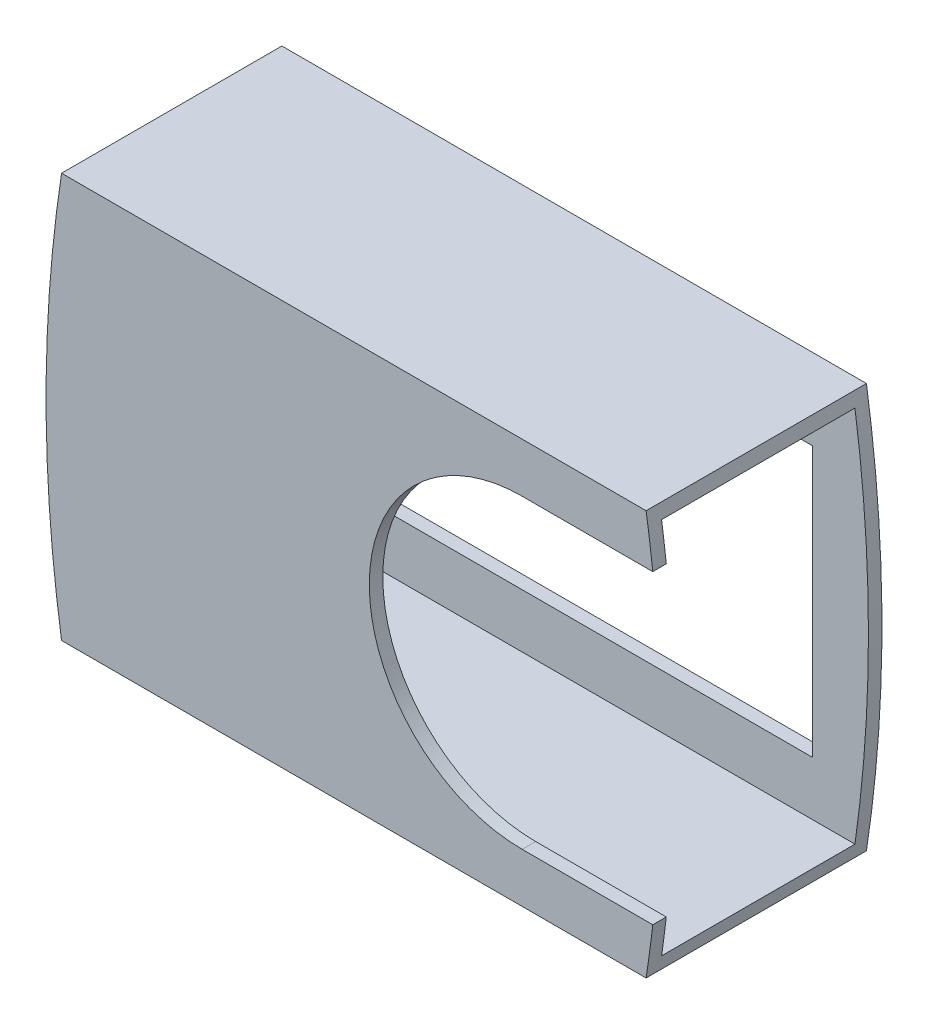
ISO-10303-21;
HEADER;
FILE_DESCRIPTION(('STEP AP214'),'2;1');
FILE_NAME('part.step','',(''),(''),'','','');
FILE_SCHEMA(('AUTOMOTIVE_DESIGN { 1 0 10303 214 1 1 1 1 }'));
ENDSEC;
DATA;
#1=APPLICATION_CONTEXT('core data for automotive mechanical design processes');
#2=APPLICATION_PROTOCOL_DEFINITION('international standard','automotive_design',2000,#1);
#3=PRODUCT_CONTEXT('',#1,'mechanical');
#4=PRODUCT('Part','Part','',(#3));
#5=PRODUCT_RELATED_PRODUCT_CATEGORY('part','',(#4));
#6=PRODUCT_DEFINITION_FORMATION('','',#4);
#7=PRODUCT_DEFINITION_CONTEXT('part definition',#1,'design');
#8=PRODUCT_DEFINITION('design','',#6,#7);
#9=PRODUCT_DEFINITION_SHAPE('','',#8);
#10=(LENGTH_UNIT() NAMED_UNIT(*) SI_UNIT(.MILLI.,.METRE.));
#11=(NAMED_UNIT(*) PLANE_ANGLE_UNIT() SI_UNIT($,.RADIAN.));
#12=(NAMED_UNIT(*) SI_UNIT($,.STERADIAN.) SOLID_ANGLE_UNIT());
#13=UNCERTAINTY_MEASURE_WITH_UNIT(LENGTH_MEASURE(1.E-05),#10,'distance_accuracy_value','');
#14=(GEOMETRIC_REPRESENTATION_CONTEXT(3) GLOBAL_UNCERTAINTY_ASSIGNED_CONTEXT((#13)) GLOBAL_UNIT_ASSIGNED_CONTEXT((#10,
#11,#12)) REPRESENTATION_CONTEXT('',''));
#15=CARTESIAN_POINT('',(0.,0.,0.));
#16=DIRECTION('',(0.,0.,1.));
#17=DIRECTION('',(1.,0.,0.));
#18=AXIS2_PLACEMENT_3D('',#15,#16,#17);
#19=CARTESIAN_POINT('',(82.7796978394473,21.,21.5));
#20=DIRECTION('',(0.,0.,-1.));
#21=DIRECTION('',(-1.,0.,0.));
#22=AXIS2_PLACEMENT_3D('',#19,#20,#21);
#23=CYLINDRICAL_SURFACE('',#22,148.);
#24=DIRECTION('',(0.,0.,-1.));
#25=VECTOR('',#24,1.);
#26=CARTESIAN_POINT('',(-63.5,43.5,21.5));
#27=LINE('',#26,#25);
#28=CARTESIAN_POINT('',(-63.5,43.5,23.));
#29=VERTEX_POINT('',#28);
#30=CARTESIAN_POINT('',(-63.5,43.5,-1.5));
#31=VERTEX_POINT('',#30);
#32=EDGE_CURVE('E273',#29,#31,#27,.T.);
#33=ORIENTED_EDGE('',*,*,#32,.T.);
#34=CARTESIAN_POINT('',(82.7796978395109,21.,-1.5));
#35=DIRECTION('',(0.,0.,-1.));
#36=DIRECTION('',(1.,0.,0.));
#37=AXIS2_PLACEMENT_3D('',#34,#35,#36);
#38=CIRCLE('',#37,148.000000000063);
#39=CARTESIAN_POINT('',(-63.5,-1.49999999999997,-1.5));
#40=VERTEX_POINT('',#39);
#41=EDGE_CURVE('E239',#40,#31,#38,.T.);
#42=ORIENTED_EDGE('',*,*,#41,.F.);
#43=DIRECTION('',(0.,0.,-1.));
#44=VECTOR('',#43,1.);
#45=CARTESIAN_POINT('',(-63.5,-1.50000000000001,21.5));
#46=LINE('',#45,#44);
#47=CARTESIAN_POINT('',(-63.5,-1.50000000000001,23.));
#48=VERTEX_POINT('',#47);
#49=EDGE_CURVE('E11',#48,#40,#46,.T.);
#50=ORIENTED_EDGE('',*,*,#49,.F.);
#51=CARTESIAN_POINT('',(82.7796978394875,21.,23.));
#52=DIRECTION('',(0.,0.,1.));
#53=DIRECTION('',(1.,0.,0.));
#54=AXIS2_PLACEMENT_3D('',#51,#52,#53);
#55=CIRCLE('',#54,148.00000000004);
#56=EDGE_CURVE('E245',#29,#48,#55,.T.);
#57=ORIENTED_EDGE('',*,*,#56,.F.);
#58=EDGE_LOOP('',(#33,#42,#50,#57));
#59=FACE_BOUND('',#58,.T.);
#60=CARTESIAN_POINT('',(-65.003927775842,29.,10.75));
#61=CARTESIAN_POINT('',(-65.0039275086395,29.000001778152,10.5254139730779));
#62=CARTESIAN_POINT('',(-65.0044408002922,28.9905389115537,10.300856504589));
#63=CARTESIAN_POINT('',(-65.006478993088,28.95275471401,9.85326520765597));
#64=CARTESIAN_POINT('',(-65.008004153516,28.9244285494595,9.63023178454153));
#65=CARTESIAN_POINT('',(-65.0120253604337,28.8490746333049,9.18712075282603));
#66=CARTESIAN_POINT('',(-65.0145224162982,28.8020274375857,8.96704646411007));
#67=CARTESIAN_POINT('',(-65.0204161443319,28.6895691716779,8.53164943649704));
#68=CARTESIAN_POINT('',(-65.0238128278599,28.6241578696174,8.31632675763257));
#69=CARTESIAN_POINT('',(-65.0314070886999,28.475479422675,7.89208050910518));
#70=CARTESIAN_POINT('',(-65.0356042398523,28.3922217760662,7.6831536027865));
#71=CARTESIAN_POINT('',(-65.0446814063763,28.20842293507,7.27305743215828));
#72=CARTESIAN_POINT('',(-65.0495614321977,28.1078814761885,7.07188828662337));
#73=CARTESIAN_POINT('',(-65.0598636262581,27.8902771106051,6.67881779795567));
#74=CARTESIAN_POINT('',(-65.0652855680156,27.7732210974412,6.48691263246792));
#75=CARTESIAN_POINT('',(-65.0765216038879,27.5233435939285,6.11357235747182));
#76=CARTESIAN_POINT('',(-65.0823358332509,27.3905166541576,5.9321408993775));
#77=CARTESIAN_POINT('',(-65.0941950195167,27.1099536754241,5.58095559780392));
#78=CARTESIAN_POINT('',(-65.1002401655878,26.9622052424585,5.41121166223511));
#79=CARTESIAN_POINT('',(-65.1123852633307,26.6529370212348,5.08476770009892));
#80=CARTESIAN_POINT('',(-65.1184852158846,26.49141701098,4.92806788388218));
#81=CARTESIAN_POINT('',(-65.130567054576,26.1557479631179,4.62882205155067));
#82=CARTESIAN_POINT('',(-65.1365489380822,25.9815986444694,4.48627635057623));
#83=CARTESIAN_POINT('',(-65.1482250896887,25.6219033508485,4.21635089459825));
#84=CARTESIAN_POINT('',(-65.1539193513898,25.4363571225172,4.08897147693389));
#85=CARTESIAN_POINT('',(-65.1648609730357,25.0551071180551,3.85023816779461));
#86=CARTESIAN_POINT('',(-65.1701081476785,24.8593991838167,3.73889090802541));
#87=CARTESIAN_POINT('',(-65.1800057925897,24.4592152306856,3.53304235549022));
#88=CARTESIAN_POINT('',(-65.1846560554216,24.2547361964521,3.43854691458622));
#89=CARTESIAN_POINT('',(-65.1932248446266,23.8385659527527,3.26714103921547));
#90=CARTESIAN_POINT('',(-65.197143508082,23.62687610321,3.19022730979499));
#91=CARTESIAN_POINT('',(-65.2041389017272,23.1977508539469,3.05451213116238));
#92=CARTESIAN_POINT('',(-65.2072156199664,22.9803153727201,2.99571093904099));
#93=CARTESIAN_POINT('',(-65.2124369705084,22.5414719026809,2.89669429309387));
#94=CARTESIAN_POINT('',(-65.2145825369033,22.3200681280124,2.85646021095178));
#95=CARTESIAN_POINT('',(-65.2178852318205,21.8746466157266,2.79477872726067));
#96=CARTESIAN_POINT('',(-65.2190423390992,21.6506288220345,2.77333172947807));
#97=CARTESIAN_POINT('',(-65.2203350647745,21.2016231940836,2.74938231505168));
#98=CARTESIAN_POINT('',(-65.2204708796531,20.9766355547434,2.7468762544428));
#99=CARTESIAN_POINT('',(-65.2197175511409,20.5271720454049,2.76081956172219));
#100=CARTESIAN_POINT('',(-65.2188280530098,20.3026963794711,2.77727549012589));
#101=CARTESIAN_POINT('',(-65.2160504912139,19.856209598079,2.82900333211636));
#102=CARTESIAN_POINT('',(-65.2141636551347,19.6341957946473,2.86425211474826));
#103=CARTESIAN_POINT('',(-65.209445569767,19.1939265091189,2.95329935576034));
#104=CARTESIAN_POINT('',(-65.2066143054561,18.9756710868622,3.00709810920209));
#105=CARTESIAN_POINT('',(-65.2000875796259,18.5444748112065,3.13285933794598));
#106=CARTESIAN_POINT('',(-65.1963921317999,18.3315338736568,3.20482152544372));
#107=CARTESIAN_POINT('',(-65.1882414929477,17.9124675574178,3.36639820038257));
#108=CARTESIAN_POINT('',(-65.1837862845219,17.7063423349483,3.4560130921061));
#109=CARTESIAN_POINT('',(-65.1742405674191,17.3023028095391,3.65228939543196));
#110=CARTESIAN_POINT('',(-65.1691498425773,17.104391331092,3.75895661069846));
#111=CARTESIAN_POINT('',(-65.1584764643809,16.7181872933254,3.98859707410967));
#112=CARTESIAN_POINT('',(-65.1528936413549,16.5298980873148,4.11157595381751));
#113=CARTESIAN_POINT('',(-65.1413965843025,16.1643758911386,4.37291548088169));
#114=CARTESIAN_POINT('',(-65.1354824080054,15.9871409863658,4.51127345296241));
#115=CARTESIAN_POINT('',(-65.1234889757667,15.6449417501266,4.80241079464234));
#116=CARTESIAN_POINT('',(-65.1174097171132,15.4799776204161,4.95519040126817));
#117=CARTESIAN_POINT('',(-65.1052505484192,15.1632895154791,5.27428970240955));
#118=CARTESIAN_POINT('',(-65.0991706472337,15.0115825074914,5.4406262367951));
#119=CARTESIAN_POINT('',(-65.0871902751648,14.7227152162388,5.78549680900998));
#120=CARTESIAN_POINT('',(-65.081289808414,14.5855552678364,5.96403112746789));
#121=CARTESIAN_POINT('',(-65.0698370472099,14.3267840336145,6.33199486988701));
#122=CARTESIAN_POINT('',(-65.0642846891141,14.2051699014079,6.52142229012223));
#123=CARTESIAN_POINT('',(-65.0536828657963,13.9782867134129,6.90992671411362));
#124=CARTESIAN_POINT('',(-65.0486335752432,13.8730233276882,7.10900703401081));
#125=CARTESIAN_POINT('',(-65.0391844109134,13.6796567793309,7.51531496953911));
#126=CARTESIAN_POINT('',(-65.0347844468293,13.5915512298662,7.72254144712842));
#127=CARTESIAN_POINT('',(-65.0267583369048,13.4331109613769,8.14369804024566));
#128=CARTESIAN_POINT('',(-65.0231322014129,13.3627764800047,8.35762824537953));
#129=CARTESIAN_POINT('',(-65.016757266019,13.2403854913655,8.79066189294827));
#130=CARTESIAN_POINT('',(-65.0140084442009,13.1883285275078,9.0097652060078));
#131=CARTESIAN_POINT('',(-65.0094663845299,13.1028630366404,9.45159405745717));
#132=CARTESIAN_POINT('',(-65.0076731670162,13.0694549065547,9.67431967284071));
#133=CARTESIAN_POINT('',(-65.0050955155874,13.0215647786484,10.1214662985437));
#134=CARTESIAN_POINT('',(-65.0043095828284,13.0070546599849,10.3458842888688));
#135=CARTESIAN_POINT('',(-65.0037638383266,12.9969705402532,10.7952421757538));
#136=CARTESIAN_POINT('',(-65.0040044627893,13.0014045889574,11.0201822535762));
#137=CARTESIAN_POINT('',(-65.0055059638065,13.0291951740262,11.4688860302054));
#138=CARTESIAN_POINT('',(-65.0067668362131,13.0525516334597,11.6926497337912));
#139=CARTESIAN_POINT('',(-65.0102721531523,13.1180052681597,12.137314043657));
#140=CARTESIAN_POINT('',(-65.0125161793936,13.1600944735369,12.3582158264596));
#141=CARTESIAN_POINT('',(-65.0179228490005,13.2626908293254,12.7956016684644));
#142=CARTESIAN_POINT('',(-65.021085150171,13.3231911192487,13.0120873412255));
#143=CARTESIAN_POINT('',(-65.028238760903,13.4621809726772,13.4391849820139));
#144=CARTESIAN_POINT('',(-65.0322300515188,13.5406701250702,13.6497970841506));
#145=CARTESIAN_POINT('',(-65.0409284949611,13.7150807438047,14.0636655221061));
#146=CARTESIAN_POINT('',(-65.0456356645768,13.811002618999,14.2669216852708));
#147=CARTESIAN_POINT('',(-65.0556322453364,14.0195935037711,14.664632241328));
#148=CARTESIAN_POINT('',(-65.0609216488822,14.1322622948109,14.8590867490342));
#149=CARTESIAN_POINT('',(-65.0719394388011,14.3736913034456,15.2380471790907));
#150=CARTESIAN_POINT('',(-65.0776683377779,14.5024704251019,15.4225410433003));
#151=CARTESIAN_POINT('',(-65.0893950623745,14.775053378055,15.7799637583814));
#152=CARTESIAN_POINT('',(-65.0953927946413,14.9188520165021,15.9528965726802));
#153=CARTESIAN_POINT('',(-65.1074902631326,15.2205208225157,16.2860756011348));
#154=CARTESIAN_POINT('',(-65.1135900185552,15.3783936632324,16.4463193942717));
#155=CARTESIAN_POINT('',(-65.1257175045837,15.707066309976,16.7529462238593));
#156=CARTESIAN_POINT('',(-65.1317452367427,15.8778658366666,16.8993295596707));
#157=CARTESIAN_POINT('',(-65.1435643740995,16.2313735174741,17.1773494098524));
#158=CARTESIAN_POINT('',(-65.149355522717,16.4140940704189,17.3089701703728));
#159=CARTESIAN_POINT('',(-65.1605303048558,16.7899829620442,17.5563483499307));
#160=CARTESIAN_POINT('',(-65.1659139448871,16.9831511337411,17.6721060224025));
#161=CARTESIAN_POINT('',(-65.1761219304677,17.3786027185168,17.8869549628864));
#162=CARTESIAN_POINT('',(-65.1809461761919,17.5808877496032,17.986043257628));
#163=CARTESIAN_POINT('',(-65.1898956871719,17.993031937137,18.1667889537121));
#164=CARTESIAN_POINT('',(-65.1940211949399,18.2028884349418,18.2484524052909));
#165=CARTESIAN_POINT('',(-65.2014567810418,18.6286727354312,18.393781249989));
#166=CARTESIAN_POINT('',(-65.2047671543526,18.8445983102596,18.4574531550349));
#167=CARTESIAN_POINT('',(-65.2104803691541,19.2810525558209,18.56638073961));
#168=CARTESIAN_POINT('',(-65.2128832309075,19.5015811236637,18.6116368303224));
#169=CARTESIAN_POINT('',(-65.2167133102086,19.9456782724215,18.6834103493834));
#170=CARTESIAN_POINT('',(-65.2181405148597,20.1692468934819,18.7099275300292));
#171=CARTESIAN_POINT('',(-65.2199786654922,20.617823945215,18.7440313156516));
#172=CARTESIAN_POINT('',(-65.220389628137,20.8428323522189,18.7516182310265));
#173=CARTESIAN_POINT('',(-65.2201837827638,21.2924410752561,18.7478099200176));
#174=CARTESIAN_POINT('',(-65.2195681009735,21.5170415682499,18.7364354942088));
#175=CARTESIAN_POINT('',(-65.2173289562002,21.9644058688189,18.694832926644));
#176=CARTESIAN_POINT('',(-65.2157058427294,22.1871702862433,18.6646113235959));
#177=CARTESIAN_POINT('',(-65.2114977305525,22.6293991062535,18.5855295284407));
#178=CARTESIAN_POINT('',(-65.2089125536961,22.8488628898077,18.5366658842459));
#179=CARTESIAN_POINT('',(-65.2028536430302,23.2828846817435,18.4206515416531));
#180=CARTESIAN_POINT('',(-65.1993799284387,23.4974427961192,18.3535012387704));
#181=CARTESIAN_POINT('',(-65.191642184809,23.9201404895079,18.2013913660712));
#182=CARTESIAN_POINT('',(-65.1873781396346,24.1282799373705,18.1164314326328));
#183=CARTESIAN_POINT('',(-65.1781805194952,24.5366581748857,17.9293102108794));
#184=CARTESIAN_POINT('',(-65.1732469542179,24.7368970788028,17.8271491714544));
#185=CARTESIAN_POINT('',(-65.1628490191566,25.1280898868974,17.6063349596051));
#186=CARTESIAN_POINT('',(-65.1573845704215,25.3190424036788,17.4876793330274));
#187=CARTESIAN_POINT('',(-65.1460819970504,25.69021635542,17.2347734128692));
#188=CARTESIAN_POINT('',(-65.1402440017048,25.8704414620664,17.1005285020228));
#189=CARTESIAN_POINT('',(-65.1283495952553,26.2191948584213,16.8171701177611));
#190=CARTESIAN_POINT('',(-65.1222928999157,26.3877070281168,16.6680368154357));
#191=CARTESIAN_POINT('',(-65.1101403329518,26.7115699319121,16.3561139543431));
#192=CARTESIAN_POINT('',(-65.1040444622076,26.8669209606071,16.193324701409));
#193=CARTESIAN_POINT('',(-65.0919845997344,27.1634047370927,15.8551947971149));
#194=CARTESIAN_POINT('',(-65.0860206434239,27.3045337016247,15.6798508271396));
#195=CARTESIAN_POINT('',(-65.0743956133338,27.5715227113629,15.3178947606072));
#196=CARTESIAN_POINT('',(-65.068734534887,27.6973829918851,15.1312828377746));
#197=CARTESIAN_POINT('',(-65.0578692011723,27.9330883872982,14.7478728510024));
#198=CARTESIAN_POINT('',(-65.0526655198185,28.0429134932402,14.5510624690179));
#199=CARTESIAN_POINT('',(-65.0428729227491,28.2455409240974,14.1489424177265));
#200=CARTESIAN_POINT('',(-65.0382837826934,28.3383494655463,13.9436358859858));
#201=CARTESIAN_POINT('',(-65.029852519319,28.5062567895374,13.5260931848419));
#202=CARTESIAN_POINT('',(-65.02600974865,28.5813709311493,13.3138632086837));
#203=CARTESIAN_POINT('',(-65.0191765090994,28.7134366214301,12.8838875218259));
#204=CARTESIAN_POINT('',(-65.016185820534,28.7703928520219,12.6661432486149));
#205=CARTESIAN_POINT('',(-65.0104686030225,28.8784784402558,12.1679841148645));
#206=CARTESIAN_POINT('',(-65.0080249231111,28.9240088990575,11.8863335258383));
#207=CARTESIAN_POINT('',(-65.0047546797992,28.9847685358796,11.3197733071697));
#208=CARTESIAN_POINT('',(-65.0039281147602,28.9999977446018,11.0348636808298));
#209=CARTESIAN_POINT('',(-65.003927775842,29.,10.75));
#210=B_SPLINE_CURVE_WITH_KNOTS('',3,(#60,#61,#62,#63,#64,#65,#66,#67,#68,#69,#70,#71,#72,#73,
#74,#75,#76,#77,#78,#79,#80,#81,#82,#83,#84,#85,#86,#87,#88,#89,#90,#91,#92,#93,#94,#95,#96,#97,
#98,#99,#100,#101,#102,#103,#104,#105,#106,#107,#108,#109,#110,#111,#112,#113,#114,#115,#116,
#117,#118,#119,#120,#121,#122,#123,#124,#125,#126,#127,#128,#129,#130,#131,#132,#133,#134,#135,
#136,#137,#138,#139,#140,#141,#142,#143,#144,#145,#146,#147,#148,#149,#150,#151,#152,#153,#154,
#155,#156,#157,#158,#159,#160,#161,#162,#163,#164,#165,#166,#167,#168,#169,#170,#171,#172,#173,
#174,#175,#176,#177,#178,#179,#180,#181,#182,#183,#184,#185,#186,#187,#188,#189,#190,#191,#192,
#193,#194,#195,#196,#197,#198,#199,#200,#201,#202,#203,#204,#205,#206,#207,#208,#209),
.UNSPECIFIED.,.T.,.F.,(4,2,2,2,2,2,2,2,2,2,2,2,2,2,2,2,2,2,2,2,2,2,2,2,2,2,2,2,2,2,2,2,2,2,2,2,
2,2,2,2,2,2,2,2,2,2,2,2,2,2,2,2,2,2,2,2,2,2,2,2,2,2,2,2,2,2,2,2,2,2,2,2,2,2,4),(0.,
0.673509171918443,1.34719099289856,2.0215743500824,2.69596622265992,3.37000005420812,
4.04404420140929,4.71780781568741,5.39180492077098,6.06636653505434,6.74093902527198,
7.41552653142945,8.0901290394363,8.7650098001417,9.44012446149892,10.1151124970364,
10.7901101129644,11.46442902587,12.1387624306815,12.812966100099,13.4874031022105,
14.1610118917562,14.8346313964262,15.5082402280881,16.1818644885406,16.8557185033056,
17.529805773082,18.2037759647331,18.8777572353429,19.552588845013,20.2274359854423,
20.9021593860856,21.577116245463,22.2519791442019,22.9268510674022,23.6017061304311,
24.2765755566114,24.9504396038881,25.624590018542,26.2987376923764,26.9725988223207,
27.6462091594853,28.3198041036969,28.9934148478886,29.6670168026002,30.341416717377,
31.0155842320516,31.6898800670488,32.36416133516,33.0391554490336,33.7141387777047,
34.3892423739138,35.0641111785125,35.738735404814,36.4133445674658,37.0879626473628,
37.7625696655181,38.4364371272386,39.1100709320445,39.7838295393058,40.4575735752525,
41.1313313684766,41.8050794136599,42.4789278102102,43.1525442254893,43.8270700699227,
44.5015808119816,45.1762705118552,45.8509498123087,46.5264639225296,47.2017307583993,
47.8764092722288,48.5509136827474,49.4051898761914,50.2594652040676),.UNSPECIFIED.);
#211=CARTESIAN_POINT('',(-65.003927775842,29.,10.75));
#212=VERTEX_POINT('',#211);
#213=EDGE_CURVE('E169',#212,#212,#210,.T.);
#214=ORIENTED_EDGE('',*,*,#213,.F.);
#215=EDGE_LOOP('',(#214));
#216=FACE_BOUND('',#215,.T.);
#217=ADVANCED_FACE('F33',(#59,#216),#23,.T.);
#218=CARTESIAN_POINT('',(84.5025597046004,21.,21.5));
#219=DIRECTION('',(0.,0.,-1.));
#220=DIRECTION('',(-1.,0.,0.));
#221=AXIS2_PLACEMENT_3D('',#218,#219,#220);
#222=CYLINDRICAL_SURFACE('',#221,148.);
#223=CARTESIAN_POINT('',(84.5025597046004,21.,0.));
#224=DIRECTION('',(0.,0.,1.));
#225=DIRECTION('',(1.,0.,0.));
#226=AXIS2_PLACEMENT_3D('',#223,#224,#225);
#227=CIRCLE('',#226,148.);
#228=CARTESIAN_POINT('',(-62.,42.,0.));
#229=VERTEX_POINT('',#228);
#230=CARTESIAN_POINT('',(-62.,0.,0.));
#231=VERTEX_POINT('',#230);
#232=EDGE_CURVE('E266',#229,#231,#227,.T.);
#233=ORIENTED_EDGE('',*,*,#232,.F.);
#234=DIRECTION('',(0.,0.,-1.));
#235=VECTOR('',#234,1.);
#236=CARTESIAN_POINT('',(-62.,42.,21.5));
#237=LINE('',#236,#235);
#238=CARTESIAN_POINT('',(-62.,42.,21.5));
#239=VERTEX_POINT('',#238);
#240=EDGE_CURVE('E271',#239,#229,#237,.T.);
#241=ORIENTED_EDGE('',*,*,#240,.F.);
#242=CARTESIAN_POINT('',(84.5025597046004,21.,21.5));
#243=DIRECTION('',(0.,0.,1.));
#244=DIRECTION('',(1.,0.,0.));
#245=AXIS2_PLACEMENT_3D('',#242,#243,#244);
#246=CIRCLE('',#245,148.);
#247=CARTESIAN_POINT('',(-62.,0.,21.5));
#248=VERTEX_POINT('',#247);
#249=EDGE_CURVE('E157',#239,#248,#246,.T.);
#250=ORIENTED_EDGE('',*,*,#249,.T.);
#251=DIRECTION('',(0.,0.,-1.));
#252=VECTOR('',#251,1.);
#253=CARTESIAN_POINT('',(-62.,0.,21.5));
#254=LINE('',#253,#252);
#255=EDGE_CURVE('E155',#248,#231,#254,.T.);
#256=ORIENTED_EDGE('',*,*,#255,.T.);
#257=EDGE_LOOP('',(#233,#241,#250,#256));
#258=FACE_BOUND('',#257,.T.);
#259=CARTESIAN_POINT('',(-63.281065910689,29.,10.75));
#260=CARTESIAN_POINT('',(-63.2810656434864,29.000001778152,10.5254139730779));
#261=CARTESIAN_POINT('',(-63.281578935139,28.9905389115537,10.300856504589));
#262=CARTESIAN_POINT('',(-63.2836171279348,28.95275471401,9.85326520765597));
#263=CARTESIAN_POINT('',(-63.2851422883629,28.9244285494595,9.63023178454153));
#264=CARTESIAN_POINT('',(-63.2891634952806,28.8490746333049,9.18712075282603));
#265=CARTESIAN_POINT('',(-63.2916605511451,28.8020274375857,8.96704646411007));
#266=CARTESIAN_POINT('',(-63.2975542791788,28.6895691716779,8.53164943649704));
#267=CARTESIAN_POINT('',(-63.3009509627068,28.6241578696174,8.31632675763256));
#268=CARTESIAN_POINT('',(-63.3085452235468,28.475479422675,7.89208050910517));
#269=CARTESIAN_POINT('',(-63.3127423746992,28.3922217760662,7.6831536027865));
#270=CARTESIAN_POINT('',(-63.3218195412232,28.20842293507,7.27305743215828));
#271=CARTESIAN_POINT('',(-63.3266995670445,28.1078814761885,7.07188828662337));
#272=CARTESIAN_POINT('',(-63.337001761105,27.8902771106051,6.67881779795567));
#273=CARTESIAN_POINT('',(-63.3424237028625,27.7732210974412,6.48691263246791));
#274=CARTESIAN_POINT('',(-63.3536597387348,27.5233435939285,6.11357235747182));
#275=CARTESIAN_POINT('',(-63.3594739680978,27.3905166541576,5.9321408993775));
#276=CARTESIAN_POINT('',(-63.3713331543636,27.1099536754241,5.58095559780391));
#277=CARTESIAN_POINT('',(-63.3773783004347,26.9622052424585,5.4112116622351));
#278=CARTESIAN_POINT('',(-63.3895233981776,26.6529370212348,5.08476770009892));
#279=CARTESIAN_POINT('',(-63.3956233507316,26.49141701098,4.92806788388218));
#280=CARTESIAN_POINT('',(-63.4077051894229,26.1557479631179,4.62882205155067));
#281=CARTESIAN_POINT('',(-63.4136870729291,25.9815986444694,4.48627635057623));
#282=CARTESIAN_POINT('',(-63.4253632245355,25.6219033508485,4.21635089459825));
#283=CARTESIAN_POINT('',(-63.4310574862367,25.4363571225172,4.08897147693389));
#284=CARTESIAN_POINT('',(-63.4419991078826,25.0551071180551,3.85023816779461));
#285=CARTESIAN_POINT('',(-63.4472462825254,24.8593991838167,3.73889090802542));
#286=CARTESIAN_POINT('',(-63.4571439274366,24.4592152306856,3.53304235549022));
#287=CARTESIAN_POINT('',(-63.4617941902685,24.2547361964521,3.43854691458622));
#288=CARTESIAN_POINT('',(-63.4703629794735,23.8385659527527,3.26714103921547));
#289=CARTESIAN_POINT('',(-63.4742816429289,23.62687610321,3.19022730979499));
#290=CARTESIAN_POINT('',(-63.4812770365741,23.1977508539469,3.05451213116238));
#291=CARTESIAN_POINT('',(-63.4843537548133,22.9803153727201,2.99571093904099));
#292=CARTESIAN_POINT('',(-63.4895751053553,22.5414719026809,2.89669429309387));
#293=CARTESIAN_POINT('',(-63.4917206717502,22.3200681280124,2.85646021095178));
#294=CARTESIAN_POINT('',(-63.4950233666674,21.8746466157266,2.79477872726067));
#295=CARTESIAN_POINT('',(-63.4961804739461,21.6506288220345,2.77333172947807));
#296=CARTESIAN_POINT('',(-63.4974731996213,21.2016231940836,2.74938231505168));
#297=CARTESIAN_POINT('',(-63.4976090144999,20.9766355547434,2.7468762544428));
#298=CARTESIAN_POINT('',(-63.4968556859878,20.5271720454049,2.76081956172219));
#299=CARTESIAN_POINT('',(-63.4959661878567,20.3026963794711,2.77727549012589));
#300=CARTESIAN_POINT('',(-63.4931886260608,19.856209598079,2.82900333211636));
#301=CARTESIAN_POINT('',(-63.4913017899817,19.6341957946473,2.86425211474826));
#302=CARTESIAN_POINT('',(-63.4865837046139,19.1939265091189,2.95329935576034));
#303=CARTESIAN_POINT('',(-63.483752440303,18.9756710868622,3.00709810920209));
#304=CARTESIAN_POINT('',(-63.4772257144728,18.5444748112065,3.13285933794598));
#305=CARTESIAN_POINT('',(-63.4735302666467,18.3315338736568,3.20482152544372));
#306=CARTESIAN_POINT('',(-63.4653796277946,17.9124675574178,3.36639820038258));
#307=CARTESIAN_POINT('',(-63.4609244193688,17.7063423349483,3.45601309210611));
#308=CARTESIAN_POINT('',(-63.451378702266,17.3023028095391,3.65228939543197));
#309=CARTESIAN_POINT('',(-63.4462879774242,17.104391331092,3.75895661069847));
#310=CARTESIAN_POINT('',(-63.4356145992278,16.7181872933253,3.98859707410967));
#311=CARTESIAN_POINT('',(-63.4300317762018,16.5298980873148,4.11157595381752));
#312=CARTESIAN_POINT('',(-63.4185347191494,16.1643758911386,4.3729154808817));
#313=CARTESIAN_POINT('',(-63.4126205428522,15.9871409863658,4.51127345296241));
#314=CARTESIAN_POINT('',(-63.4006271106136,15.6449417501266,4.80241079464234));
#315=CARTESIAN_POINT('',(-63.3945478519601,15.4799776204161,4.95519040126817));
#316=CARTESIAN_POINT('',(-63.3823886832661,15.1632895154791,5.27428970240955));
#317=CARTESIAN_POINT('',(-63.3763087820806,15.0115825074914,5.44062623679511));
#318=CARTESIAN_POINT('',(-63.3643284100117,14.7227152162388,5.78549680900999));
#319=CARTESIAN_POINT('',(-63.3584279432609,14.5855552678364,5.96403112746789));
#320=CARTESIAN_POINT('',(-63.3469751820568,14.3267840336145,6.33199486988702));
#321=CARTESIAN_POINT('',(-63.341422823961,14.2051699014079,6.52142229012223));
#322=CARTESIAN_POINT('',(-63.3308210006432,13.9782867134129,6.90992671411362));
#323=CARTESIAN_POINT('',(-63.3257717100901,13.8730233276882,7.10900703401081));
#324=CARTESIAN_POINT('',(-63.3163225457603,13.6796567793309,7.51531496953912));
#325=CARTESIAN_POINT('',(-63.3119225816762,13.5915512298662,7.72254144712842));
#326=CARTESIAN_POINT('',(-63.3038964717517,13.4331109613769,8.14369804024567));
#327=CARTESIAN_POINT('',(-63.3002703362598,13.3627764800048,8.35762824537954));
#328=CARTESIAN_POINT('',(-63.2938954008658,13.2403854913655,8.79066189294827));
#329=CARTESIAN_POINT('',(-63.2911465790477,13.1883285275078,9.00976520600781));
#330=CARTESIAN_POINT('',(-63.2866045193768,13.1028630366404,9.45159405745717));
#331=CARTESIAN_POINT('',(-63.2848113018631,13.0694549065547,9.67431967284071));
#332=CARTESIAN_POINT('',(-63.2822336504343,13.0215647786484,10.1214662985438));
#333=CARTESIAN_POINT('',(-63.2814477176753,13.0070546599849,10.3458842888688));
#334=CARTESIAN_POINT('',(-63.2809019731734,12.9969705402532,10.7952421757538));
#335=CARTESIAN_POINT('',(-63.2811425976362,13.0014045889574,11.0201822535762));
#336=CARTESIAN_POINT('',(-63.2826440986534,13.0291951740262,11.4688860302054));
#337=CARTESIAN_POINT('',(-63.28390497106,13.0525516334597,11.6926497337912));
#338=CARTESIAN_POINT('',(-63.2874102879992,13.1180052681597,12.137314043657));
#339=CARTESIAN_POINT('',(-63.2896543142404,13.1600944735369,12.3582158264596));
#340=CARTESIAN_POINT('',(-63.2950609838474,13.2626908293254,12.7956016684644));
#341=CARTESIAN_POINT('',(-63.2982232850179,13.3231911192487,13.0120873412255));
#342=CARTESIAN_POINT('',(-63.3053768957499,13.4621809726772,13.4391849820139));
#343=CARTESIAN_POINT('',(-63.3093681863657,13.5406701250702,13.6497970841506));
#344=CARTESIAN_POINT('',(-63.3180666298079,13.7150807438047,14.0636655221061));
#345=CARTESIAN_POINT('',(-63.3227737994237,13.811002618999,14.2669216852708));
#346=CARTESIAN_POINT('',(-63.3327703801833,14.0195935037711,14.664632241328));
#347=CARTESIAN_POINT('',(-63.3380597837292,14.1322622948109,14.8590867490342));
#348=CARTESIAN_POINT('',(-63.349077573648,14.3736913034457,15.2380471790907));
#349=CARTESIAN_POINT('',(-63.3548064726247,14.5024704251019,15.4225410433003));
#350=CARTESIAN_POINT('',(-63.3665331972214,14.775053378055,15.7799637583814));
#351=CARTESIAN_POINT('',(-63.3725309294881,14.9188520165021,15.9528965726802));
#352=CARTESIAN_POINT('',(-63.3846283979795,15.2205208225157,16.2860756011348));
#353=CARTESIAN_POINT('',(-63.3907281534021,15.3783936632324,16.4463193942717));
#354=CARTESIAN_POINT('',(-63.4028556394306,15.707066309976,16.7529462238593));
#355=CARTESIAN_POINT('',(-63.4088833715897,15.8778658366666,16.8993295596707));
#356=CARTESIAN_POINT('',(-63.4207025089464,16.2313735174741,17.1773494098524));
#357=CARTESIAN_POINT('',(-63.4264936575639,16.4140940704189,17.3089701703728));
#358=CARTESIAN_POINT('',(-63.4376684397027,16.7899829620442,17.5563483499307));
#359=CARTESIAN_POINT('',(-63.443052079734,16.9831511337411,17.6721060224025));
#360=CARTESIAN_POINT('',(-63.4532600653146,17.3786027185168,17.8869549628864));
#361=CARTESIAN_POINT('',(-63.4580843110387,17.5808877496032,17.986043257628));
#362=CARTESIAN_POINT('',(-63.4670338220187,17.993031937137,18.1667889537121));
#363=CARTESIAN_POINT('',(-63.4711593297867,18.2028884349419,18.2484524052909));
#364=CARTESIAN_POINT('',(-63.4785949158887,18.6286727354312,18.393781249989));
#365=CARTESIAN_POINT('',(-63.4819052891995,18.8445983102597,18.4574531550349));
#366=CARTESIAN_POINT('',(-63.487618504001,19.2810525558209,18.56638073961));
#367=CARTESIAN_POINT('',(-63.4900213657544,19.5015811236637,18.6116368303224));
#368=CARTESIAN_POINT('',(-63.4938514450555,19.9456782724215,18.6834103493834));
#369=CARTESIAN_POINT('',(-63.4952786497065,20.1692468934819,18.7099275300292));
#370=CARTESIAN_POINT('',(-63.4971168003391,20.617823945215,18.7440313156516));
#371=CARTESIAN_POINT('',(-63.4975277629839,20.8428323522189,18.7516182310265));
#372=CARTESIAN_POINT('',(-63.4973219176106,21.2924410752561,18.7478099200176));
#373=CARTESIAN_POINT('',(-63.4967062358204,21.5170415682499,18.7364354942088));
#374=CARTESIAN_POINT('',(-63.4944670910471,21.9644058688189,18.694832926644));
#375=CARTESIAN_POINT('',(-63.4928439775763,22.1871702862433,18.6646113235959));
#376=CARTESIAN_POINT('',(-63.4886358653994,22.6293991062536,18.5855295284407));
#377=CARTESIAN_POINT('',(-63.4860506885429,22.8488628898077,18.5366658842459));
#378=CARTESIAN_POINT('',(-63.4799917778771,23.2828846817435,18.4206515416531));
#379=CARTESIAN_POINT('',(-63.4765180632856,23.4974427961193,18.3535012387704));
#380=CARTESIAN_POINT('',(-63.4687803196558,23.920140489508,18.2013913660712));
#381=CARTESIAN_POINT('',(-63.4645162744815,24.1282799373705,18.1164314326328));
#382=CARTESIAN_POINT('',(-63.4553186543421,24.5366581748857,17.9293102108794));
#383=CARTESIAN_POINT('',(-63.4503850890647,24.7368970788028,17.8271491714544));
#384=CARTESIAN_POINT('',(-63.4399871540035,25.1280898868974,17.6063349596051));
#385=CARTESIAN_POINT('',(-63.4345227052684,25.3190424036788,17.4876793330274));
#386=CARTESIAN_POINT('',(-63.4232201318973,25.69021635542,17.2347734128692));
#387=CARTESIAN_POINT('',(-63.4173821365517,25.8704414620664,17.1005285020228));
#388=CARTESIAN_POINT('',(-63.4054877301022,26.2191948584213,16.8171701177611));
#389=CARTESIAN_POINT('',(-63.3994310347626,26.3877070281168,16.6680368154356));
#390=CARTESIAN_POINT('',(-63.3872784677987,26.7115699319122,16.3561139543431));
#391=CARTESIAN_POINT('',(-63.3811825970545,26.8669209606071,16.193324701409));
#392=CARTESIAN_POINT('',(-63.3691227345813,27.1634047370927,15.8551947971149));
#393=CARTESIAN_POINT('',(-63.3631587782709,27.3045337016247,15.6798508271396));
#394=CARTESIAN_POINT('',(-63.3515337481807,27.5715227113629,15.3178947606072));
#395=CARTESIAN_POINT('',(-63.3458726697339,27.6973829918851,15.1312828377745));
#396=CARTESIAN_POINT('',(-63.3350073360191,27.9330883872982,14.7478728510024));
#397=CARTESIAN_POINT('',(-63.3298036546655,28.0429134932402,14.5510624690179));
#398=CARTESIAN_POINT('',(-63.320011057596,28.2455409240974,14.1489424177265));
#399=CARTESIAN_POINT('',(-63.3154219175403,28.3383494655463,13.9436358859858));
#400=CARTESIAN_POINT('',(-63.3069906541659,28.5062567895374,13.5260931848419));
#401=CARTESIAN_POINT('',(-63.3031478834969,28.5813709311494,13.3138632086837));
#402=CARTESIAN_POINT('',(-63.2963146439463,28.7134366214301,12.8838875218259));
#403=CARTESIAN_POINT('',(-63.293323955381,28.7703928520219,12.6661432486149));
#404=CARTESIAN_POINT('',(-63.2876067378694,28.8784784402558,12.1679841148645));
#405=CARTESIAN_POINT('',(-63.285163057958,28.9240088990575,11.8863335258382));
#406=CARTESIAN_POINT('',(-63.2818928146461,28.9847685358796,11.3197733071697));
#407=CARTESIAN_POINT('',(-63.2810662496072,28.9999977446018,11.0348636808298));
#408=CARTESIAN_POINT('',(-63.281065910689,29.,10.75));
#409=B_SPLINE_CURVE_WITH_KNOTS('',3,(#259,#260,#261,#262,#263,#264,#265,#266,#267,#268,#269,
#270,#271,#272,#273,#274,#275,#276,#277,#278,#279,#280,#281,#282,#283,#284,#285,#286,#287,#288,
#289,#290,#291,#292,#293,#294,#295,#296,#297,#298,#299,#300,#301,#302,#303,#304,#305,#306,#307,
#308,#309,#310,#311,#312,#313,#314,#315,#316,#317,#318,#319,#320,#321,#322,#323,#324,#325,#326,
#327,#328,#329,#330,#331,#332,#333,#334,#335,#336,#337,#338,#339,#340,#341,#342,#343,#344,#345,
#346,#347,#348,#349,#350,#351,#352,#353,#354,#355,#356,#357,#358,#359,#360,#361,#362,#363,#364,
#365,#366,#367,#368,#369,#370,#371,#372,#373,#374,#375,#376,#377,#378,#379,#380,#381,#382,#383,
#384,#385,#386,#387,#388,#389,#390,#391,#392,#393,#394,#395,#396,#397,#398,#399,#400,#401,#402,
#403,#404,#405,#406,#407,#408),.UNSPECIFIED.,.T.,.F.,(4,2,2,2,2,2,2,2,2,2,2,2,2,2,2,2,2,2,2,2,2,
2,2,2,2,2,2,2,2,2,2,2,2,2,2,2,2,2,2,2,2,2,2,2,2,2,2,2,2,2,2,2,2,2,2,2,2,2,2,2,2,2,2,2,2,2,2,2,2,
2,2,2,2,2,4),(0.,0.673509171918445,1.34719099289857,2.0215743500824,2.69596622265993,
3.37000005420812,4.0440442014093,4.71780781568742,5.39180492077098,6.06636653505434,
6.74093902527198,7.41552653142945,8.0901290394363,8.76500980014169,9.44012446149892,
10.1151124970364,10.7901101129644,11.46442902587,12.1387624306815,12.812966100099,
13.4874031022105,14.1610118917562,14.8346313964262,15.5082402280881,16.1818644885406,
16.8557185033056,17.529805773082,18.2037759647331,18.8777572353429,19.552588845013,
20.2274359854423,20.9021593860856,21.577116245463,22.2519791442019,22.9268510674022,
23.6017061304311,24.2765755566114,24.9504396038881,25.624590018542,26.2987376923764,
26.9725988223207,27.6462091594853,28.3198041036969,28.9934148478886,29.6670168026002,
30.341416717377,31.0155842320516,31.6898800670488,32.36416133516,33.0391554490336,
33.7141387777047,34.3892423739138,35.0641111785125,35.738735404814,36.4133445674658,
37.0879626473628,37.7625696655181,38.4364371272386,39.1100709320445,39.7838295393058,
40.4575735752525,41.1313313684766,41.8050794136599,42.4789278102103,43.1525442254893,
43.8270700699227,44.5015808119816,45.1762705118552,45.8509498123087,46.5264639225296,
47.2017307583993,47.8764092722288,48.5509136827474,49.4051898761914,50.2594652040676),.UNSPECIFIED.);
#410=CARTESIAN_POINT('',(-63.281065910689,29.,10.75));
#411=VERTEX_POINT('',#410);
#412=EDGE_CURVE('E37',#411,#411,#409,.T.);
#413=ORIENTED_EDGE('',*,*,#412,.T.);
#414=EDGE_LOOP('',(#413));
#415=FACE_BOUND('',#414,.T.);
#416=ADVANCED_FACE('F312',(#258,#415),#222,.F.);
#417=CARTESIAN_POINT('',(-144.779697839447,21.,21.5));
#418=DIRECTION('',(0.,0.,-1.));
#419=DIRECTION('',(-1.,0.,0.));
#420=AXIS2_PLACEMENT_3D('',#417,#418,#419);
#421=CYLINDRICAL_SURFACE('',#420,148.);
#422=CARTESIAN_POINT('',(-144.779697839447,21.,21.5));
#423=DIRECTION('',(0.,0.,-1.));
#424=DIRECTION('',(0.,1.,0.));
#425=AXIS2_PLACEMENT_3D('',#422,#423,#424);
#426=CIRCLE('',#425,148.);
#427=CARTESIAN_POINT('',(1.72286186515311,42.,21.5));
#428=VERTEX_POINT('',#427);
#429=CARTESIAN_POINT('',(2.24070890737138,38.,21.5));
#430=VERTEX_POINT('',#429);
#431=EDGE_CURVE('E168',#428,#430,#426,.T.);
#432=ORIENTED_EDGE('',*,*,#431,.F.);
#433=DIRECTION('',(0.,0.,-1.));
#434=VECTOR('',#433,1.);
#435=CARTESIAN_POINT('',(1.72286186515311,42.,21.5));
#436=LINE('',#435,#434);
#437=CARTESIAN_POINT('',(1.72286186515311,42.,0.));
#438=VERTEX_POINT('',#437);
#439=EDGE_CURVE('E177',#438,#428,#436,.F.);
#440=ORIENTED_EDGE('',*,*,#439,.F.);
#441=CARTESIAN_POINT('',(-144.779697839447,21.,0.));
#442=DIRECTION('',(0.,0.,1.));
#443=DIRECTION('',(0.,-1.,0.));
#444=AXIS2_PLACEMENT_3D('',#441,#442,#443);
#445=CIRCLE('',#444,148.);
#446=CARTESIAN_POINT('',(1.72286186515311,0.,0.));
#447=VERTEX_POINT('',#446);
#448=EDGE_CURVE('E175',#447,#438,#445,.T.);
#449=ORIENTED_EDGE('',*,*,#448,.F.);
#450=DIRECTION('',(0.,0.,-1.));
#451=VECTOR('',#450,1.);
#452=CARTESIAN_POINT('',(1.72286186515311,0.,21.5));
#453=LINE('',#452,#451);
#454=CARTESIAN_POINT('',(1.72286186515311,0.,21.5));
#455=VERTEX_POINT('',#454);
#456=EDGE_CURVE('E153',#455,#447,#453,.T.);
#457=ORIENTED_EDGE('',*,*,#456,.F.);
#458=CARTESIAN_POINT('',(2.24070890737141,4.,21.5));
#459=VERTEX_POINT('',#458);
#460=EDGE_CURVE('E160',#459,#455,#426,.T.);
#461=ORIENTED_EDGE('',*,*,#460,.F.);
#462=DIRECTION('',(0.,0.,1.));
#463=VECTOR('',#462,1.);
#464=CARTESIAN_POINT('',(2.24070890737141,4.00000000000001,21.5));
#465=LINE('',#464,#463);
#466=CARTESIAN_POINT('',(2.24070890737141,4.00000000000001,23.));
#467=VERTEX_POINT('',#466);
#468=EDGE_CURVE('E200',#459,#467,#465,.T.);
#469=ORIENTED_EDGE('',*,*,#468,.T.);
#470=CARTESIAN_POINT('',(-144.779697839443,21.,23.));
#471=DIRECTION('',(0.,0.,1.));
#472=DIRECTION('',(-1.,0.,0.));
#473=AXIS2_PLACEMENT_3D('',#470,#471,#472);
#474=CIRCLE('',#473,147.999999999996);
#475=CARTESIAN_POINT('',(1.5,-1.49999999999996,23.));
#476=VERTEX_POINT('',#475);
#477=EDGE_CURVE('E252',#476,#467,#474,.T.);
#478=ORIENTED_EDGE('',*,*,#477,.F.);
#479=DIRECTION('',(0.,0.,-1.));
#480=VECTOR('',#479,1.);
#481=CARTESIAN_POINT('',(1.5,-1.49999999999998,21.5));
#482=LINE('',#481,#480);
#483=CARTESIAN_POINT('',(1.5,-1.49999999999998,-1.5));
#484=VERTEX_POINT('',#483);
#485=EDGE_CURVE('E47',#476,#484,#482,.T.);
#486=ORIENTED_EDGE('',*,*,#485,.T.);
#487=CARTESIAN_POINT('',(-144.779697839535,21.,-1.5));
#488=DIRECTION('',(0.,0.,-1.));
#489=DIRECTION('',(-1.,0.,0.));
#490=AXIS2_PLACEMENT_3D('',#487,#488,#489);
#491=CIRCLE('',#490,148.000000000087);
#492=CARTESIAN_POINT('',(1.5,43.5,-1.5));
#493=VERTEX_POINT('',#492);
#494=EDGE_CURVE('E233',#493,#484,#491,.T.);
#495=ORIENTED_EDGE('',*,*,#494,.F.);
#496=DIRECTION('',(0.,0.,-1.));
#497=VECTOR('',#496,1.);
#498=CARTESIAN_POINT('',(1.5,43.5,21.5));
#499=LINE('',#498,#497);
#500=CARTESIAN_POINT('',(1.5,43.5,23.));
#501=VERTEX_POINT('',#500);
#502=EDGE_CURVE('E275',#501,#493,#499,.T.);
#503=ORIENTED_EDGE('',*,*,#502,.F.);
#504=CARTESIAN_POINT('',(2.24070890737138,38.,23.));
#505=VERTEX_POINT('',#504);
#506=EDGE_CURVE('E251',#505,#501,#474,.T.);
#507=ORIENTED_EDGE('',*,*,#506,.F.);
#508=DIRECTION('',(0.,0.,1.));
#509=VECTOR('',#508,1.);
#510=CARTESIAN_POINT('',(2.24070890737138,38.,21.5));
#511=LINE('',#510,#509);
#512=EDGE_CURVE('E198',#430,#505,#511,.T.);
#513=ORIENTED_EDGE('',*,*,#512,.F.);
#514=EDGE_LOOP('',(#432,#440,#449,#457,#461,#469,#478,#486,#495,#503,#507,#513));
#515=FACE_BOUND('',#514,.T.);
#516=ADVANCED_FACE('F172',(#515),#421,.T.);
#517=CARTESIAN_POINT('',(-63.5,-1.50000000000001,21.5));
#518=DIRECTION('',(0.,1.,0.));
#519=DIRECTION('',(0.,0.,1.));
#520=AXIS2_PLACEMENT_3D('',#517,#518,#519);
#521=PLANE('',#520);
#522=ORIENTED_EDGE('',*,*,#49,.T.);
#523=DIRECTION('',(-1.,0.,0.));
#524=VECTOR('',#523,1.);
#525=CARTESIAN_POINT('',(1.5,-1.49999999999998,-1.5));
#526=LINE('',#525,#524);
#527=EDGE_CURVE('E236',#484,#40,#526,.T.);
#528=ORIENTED_EDGE('',*,*,#527,.F.);
#529=ORIENTED_EDGE('',*,*,#485,.F.);
#530=DIRECTION('',(1.,0.,0.));
#531=VECTOR('',#530,1.);
#532=CARTESIAN_POINT('',(1.5,-1.49999999999998,23.));
#533=LINE('',#532,#531);
#534=EDGE_CURVE('E248',#48,#476,#533,.T.);
#535=ORIENTED_EDGE('',*,*,#534,.F.);
#536=EDGE_LOOP('',(#522,#528,#529,#535));
#537=FACE_BOUND('',#536,.T.);
#538=ADVANCED_FACE('F283',(#537),#521,.F.);
#539=CARTESIAN_POINT('',(-63.5,43.5,21.5));
#540=DIRECTION('',(0.,-1.,0.));
#541=DIRECTION('',(0.,0.,-1.));
#542=AXIS2_PLACEMENT_3D('',#539,#540,#541);
#543=PLANE('',#542);
#544=ORIENTED_EDGE('',*,*,#502,.T.);
#545=DIRECTION('',(1.,0.,0.));
#546=VECTOR('',#545,1.);
#547=CARTESIAN_POINT('',(1.5,43.5,-1.5));
#548=LINE('',#547,#546);
#549=EDGE_CURVE('E242',#31,#493,#548,.T.);
#550=ORIENTED_EDGE('',*,*,#549,.F.);
#551=ORIENTED_EDGE('',*,*,#32,.F.);
#552=DIRECTION('',(-1.,0.,0.));
#553=VECTOR('',#552,1.);
#554=CARTESIAN_POINT('',(-63.5,43.5,23.));
#555=LINE('',#554,#553);
#556=EDGE_CURVE('E255',#501,#29,#555,.T.);
#557=ORIENTED_EDGE('',*,*,#556,.F.);
#558=EDGE_LOOP('',(#544,#550,#551,#557));
#559=FACE_BOUND('',#558,.T.);
#560=ADVANCED_FACE('F290',(#559),#543,.F.);
#561=CARTESIAN_POINT('',(82.7796978394875,21.,23.));
#562=DIRECTION('',(0.,0.,1.));
#563=DIRECTION('',(1.,0.,0.));
#564=AXIS2_PLACEMENT_3D('',#561,#562,#563);
#565=PLANE('',#564);
#566=DIRECTION('',(-1.,0.,0.));
#567=VECTOR('',#566,1.);
#568=CARTESIAN_POINT('',(-12.2796978394473,38.,23.));
#569=LINE('',#568,#567);
#570=CARTESIAN_POINT('',(-12.2796978394473,38.,23.));
#571=VERTEX_POINT('',#570);
#572=EDGE_CURVE('E185',#505,#571,#569,.T.);
#573=ORIENTED_EDGE('',*,*,#572,.F.);
#574=ORIENTED_EDGE('',*,*,#506,.T.);
#575=ORIENTED_EDGE('',*,*,#556,.T.);
#576=ORIENTED_EDGE('',*,*,#56,.T.);
#577=ORIENTED_EDGE('',*,*,#534,.T.);
#578=ORIENTED_EDGE('',*,*,#477,.T.);
#579=DIRECTION('',(1.,0.,0.));
#580=VECTOR('',#579,1.);
#581=CARTESIAN_POINT('',(-12.2796978394473,4.,23.));
#582=LINE('',#581,#580);
#583=CARTESIAN_POINT('',(-12.2796978394473,4.,23.));
#584=VERTEX_POINT('',#583);
#585=EDGE_CURVE('E191',#584,#467,#582,.T.);
#586=ORIENTED_EDGE('',*,*,#585,.F.);
#587=CARTESIAN_POINT('',(-12.2796978394473,21.,23.));
#588=DIRECTION('',(0.,0.,1.));
#589=DIRECTION('',(1.,0.,0.));
#590=AXIS2_PLACEMENT_3D('',#587,#588,#589);
#591=CIRCLE('',#590,17.);
#592=EDGE_CURVE('E54',#571,#584,#591,.T.);
#593=ORIENTED_EDGE('',*,*,#592,.F.);
#594=EDGE_LOOP('',(#573,#574,#575,#576,#577,#578,#586,#593));
#595=FACE_BOUND('',#594,.T.);
#596=ADVANCED_FACE('F296',(#595),#565,.T.);
#597=CARTESIAN_POINT('',(-144.779697839535,21.,0.));
#598=DIRECTION('',(0.,0.,-1.));
#599=DIRECTION('',(-1.,0.,0.));
#600=AXIS2_PLACEMENT_3D('',#597,#598,#599);
#601=PLANE('',#600);
#602=ORIENTED_EDGE('',*,*,#448,.T.);
#603=DIRECTION('',(-1.,0.,0.));
#604=VECTOR('',#603,1.);
#605=CARTESIAN_POINT('',(-62.,42.,0.));
#606=LINE('',#605,#604);
#607=EDGE_CURVE('E258',#438,#229,#606,.T.);
#608=ORIENTED_EDGE('',*,*,#607,.T.);
#609=ORIENTED_EDGE('',*,*,#232,.T.);
#610=DIRECTION('',(1.,0.,0.));
#611=VECTOR('',#610,1.);
#612=CARTESIAN_POINT('',(0.,0.,0.));
#613=LINE('',#612,#611);
#614=EDGE_CURVE('E262',#231,#447,#613,.T.);
#615=ORIENTED_EDGE('',*,*,#614,.T.);
#616=EDGE_LOOP('',(#602,#608,#609,#615));
#617=FACE_BOUND('',#616,.T.);
#618=DIRECTION('',(0.,-1.,0.));
#619=VECTOR('',#618,1.);
#620=CARTESIAN_POINT('',(-3.,36.,0.));
#621=LINE('',#620,#619);
#622=CARTESIAN_POINT('',(-3.,36.,0.));
#623=VERTEX_POINT('',#622);
#624=CARTESIAN_POINT('',(-3.,6.,0.));
#625=VERTEX_POINT('',#624);
#626=EDGE_CURVE('E197',#623,#625,#621,.T.);
#627=ORIENTED_EDGE('',*,*,#626,.T.);
#628=DIRECTION('',(-1.,0.,0.));
#629=VECTOR('',#628,1.);
#630=CARTESIAN_POINT('',(-3.,6.,0.));
#631=LINE('',#630,#629);
#632=CARTESIAN_POINT('',(-53.,6.,0.));
#633=VERTEX_POINT('',#632);
#634=EDGE_CURVE('E216',#625,#633,#631,.T.);
#635=ORIENTED_EDGE('',*,*,#634,.T.);
#636=DIRECTION('',(0.,1.,0.));
#637=VECTOR('',#636,1.);
#638=CARTESIAN_POINT('',(-53.,36.,0.));
#639=LINE('',#638,#637);
#640=CARTESIAN_POINT('',(-53.,36.,0.));
#641=VERTEX_POINT('',#640);
#642=EDGE_CURVE('E219',#633,#641,#639,.T.);
#643=ORIENTED_EDGE('',*,*,#642,.T.);
#644=DIRECTION('',(1.,0.,0.));
#645=VECTOR('',#644,1.);
#646=CARTESIAN_POINT('',(-3.,36.,0.));
#647=LINE('',#646,#645);
#648=EDGE_CURVE('E206',#641,#623,#647,.T.);
#649=ORIENTED_EDGE('',*,*,#648,.T.);
#650=EDGE_LOOP('',(#627,#635,#643,#649));
#651=FACE_BOUND('',#650,.T.);
#652=ADVANCED_FACE('F309',(#617,#651),#601,.F.);
#653=CARTESIAN_POINT('',(-144.779697839535,21.,-1.5));
#654=DIRECTION('',(0.,0.,-1.));
#655=DIRECTION('',(-1.,0.,0.));
#656=AXIS2_PLACEMENT_3D('',#653,#654,#655);
#657=PLANE('',#656);
#658=ORIENTED_EDGE('',*,*,#494,.T.);
#659=ORIENTED_EDGE('',*,*,#527,.T.);
#660=ORIENTED_EDGE('',*,*,#41,.T.);
#661=ORIENTED_EDGE('',*,*,#549,.T.);
#662=EDGE_LOOP('',(#658,#659,#660,#661));
#663=FACE_BOUND('',#662,.T.);
#664=DIRECTION('',(-1.,0.,0.));
#665=VECTOR('',#664,1.);
#666=CARTESIAN_POINT('',(-3.,6.,-1.5));
#667=LINE('',#666,#665);
#668=CARTESIAN_POINT('',(-3.,6.,-1.5));
#669=VERTEX_POINT('',#668);
#670=CARTESIAN_POINT('',(-53.,6.,-1.5));
#671=VERTEX_POINT('',#670);
#672=EDGE_CURVE('E205',#669,#671,#667,.T.);
#673=ORIENTED_EDGE('',*,*,#672,.F.);
#674=DIRECTION('',(0.,-1.,0.));
#675=VECTOR('',#674,1.);
#676=CARTESIAN_POINT('',(-3.,36.,-1.5));
#677=LINE('',#676,#675);
#678=CARTESIAN_POINT('',(-3.,36.,-1.5));
#679=VERTEX_POINT('',#678);
#680=EDGE_CURVE('E203',#679,#669,#677,.T.);
#681=ORIENTED_EDGE('',*,*,#680,.F.);
#682=DIRECTION('',(1.,0.,0.));
#683=VECTOR('',#682,1.);
#684=CARTESIAN_POINT('',(-3.,36.,-1.5));
#685=LINE('',#684,#683);
#686=CARTESIAN_POINT('',(-53.,36.,-1.5));
#687=VERTEX_POINT('',#686);
#688=EDGE_CURVE('E211',#687,#679,#685,.T.);
#689=ORIENTED_EDGE('',*,*,#688,.F.);
#690=DIRECTION('',(0.,1.,0.));
#691=VECTOR('',#690,1.);
#692=CARTESIAN_POINT('',(-53.,36.,-1.5));
#693=LINE('',#692,#691);
#694=EDGE_CURVE('E208',#671,#687,#693,.T.);
#695=ORIENTED_EDGE('',*,*,#694,.F.);
#696=EDGE_LOOP('',(#673,#681,#689,#695));
#697=FACE_BOUND('',#696,.T.);
#698=ADVANCED_FACE('F286',(#663,#697),#657,.T.);
#699=CARTESIAN_POINT('',(-3.,36.,-1.5));
#700=DIRECTION('',(-1.,0.,0.));
#701=DIRECTION('',(0.,-1.,0.));
#702=AXIS2_PLACEMENT_3D('',#699,#700,#701);
#703=PLANE('',#702);
#704=ORIENTED_EDGE('',*,*,#626,.F.);
#705=DIRECTION('',(0.,0.,1.));
#706=VECTOR('',#705,1.);
#707=CARTESIAN_POINT('',(-3.,36.,-1.5));
#708=LINE('',#707,#706);
#709=EDGE_CURVE('E213',#679,#623,#708,.T.);
#710=ORIENTED_EDGE('',*,*,#709,.F.);
#711=ORIENTED_EDGE('',*,*,#680,.T.);
#712=DIRECTION('',(0.,0.,1.));
#713=VECTOR('',#712,1.);
#714=CARTESIAN_POINT('',(-3.,6.,-1.5));
#715=LINE('',#714,#713);
#716=EDGE_CURVE('E230',#669,#625,#715,.T.);
#717=ORIENTED_EDGE('',*,*,#716,.T.);
#718=EDGE_LOOP('',(#704,#710,#711,#717));
#719=FACE_BOUND('',#718,.T.);
#720=ADVANCED_FACE('F349',(#719),#703,.T.);
#721=CARTESIAN_POINT('',(-3.,6.,-1.5));
#722=DIRECTION('',(0.,1.,0.));
#723=DIRECTION('',(0.,0.,1.));
#724=AXIS2_PLACEMENT_3D('',#721,#722,#723);
#725=PLANE('',#724);
#726=ORIENTED_EDGE('',*,*,#634,.F.);
#727=ORIENTED_EDGE('',*,*,#716,.F.);
#728=ORIENTED_EDGE('',*,*,#672,.T.);
#729=DIRECTION('',(0.,0.,1.));
#730=VECTOR('',#729,1.);
#731=CARTESIAN_POINT('',(-53.,6.,-1.5));
#732=LINE('',#731,#730);
#733=EDGE_CURVE('E228',#671,#633,#732,.T.);
#734=ORIENTED_EDGE('',*,*,#733,.T.);
#735=EDGE_LOOP('',(#726,#727,#728,#734));
#736=FACE_BOUND('',#735,.T.);
#737=ADVANCED_FACE('F345',(#736),#725,.T.);
#738=CARTESIAN_POINT('',(-53.,36.,-1.5));
#739=DIRECTION('',(1.,0.,0.));
#740=DIRECTION('',(0.,1.,0.));
#741=AXIS2_PLACEMENT_3D('',#738,#739,#740);
#742=PLANE('',#741);
#743=ORIENTED_EDGE('',*,*,#642,.F.);
#744=ORIENTED_EDGE('',*,*,#733,.F.);
#745=ORIENTED_EDGE('',*,*,#694,.T.);
#746=DIRECTION('',(0.,0.,1.));
#747=VECTOR('',#746,1.);
#748=CARTESIAN_POINT('',(-53.,36.,-1.5));
#749=LINE('',#748,#747);
#750=EDGE_CURVE('E226',#687,#641,#749,.T.);
#751=ORIENTED_EDGE('',*,*,#750,.T.);
#752=EDGE_LOOP('',(#743,#744,#745,#751));
#753=FACE_BOUND('',#752,.T.);
#754=ADVANCED_FACE('F341',(#753),#742,.T.);
#755=CARTESIAN_POINT('',(-3.,36.,-1.5));
#756=DIRECTION('',(0.,-1.,0.));
#757=DIRECTION('',(0.,0.,-1.));
#758=AXIS2_PLACEMENT_3D('',#755,#756,#757);
#759=PLANE('',#758);
#760=ORIENTED_EDGE('',*,*,#648,.F.);
#761=ORIENTED_EDGE('',*,*,#750,.F.);
#762=ORIENTED_EDGE('',*,*,#688,.T.);
#763=ORIENTED_EDGE('',*,*,#709,.T.);
#764=EDGE_LOOP('',(#760,#761,#762,#763));
#765=FACE_BOUND('',#764,.T.);
#766=ADVANCED_FACE('F338',(#765),#759,.T.);
#767=CARTESIAN_POINT('',(82.7796978394875,21.,21.5));
#768=DIRECTION('',(0.,0.,1.));
#769=DIRECTION('',(1.,0.,0.));
#770=AXIS2_PLACEMENT_3D('',#767,#768,#769);
#771=PLANE('',#770);
#772=DIRECTION('',(-1.,0.,0.));
#773=VECTOR('',#772,1.);
#774=CARTESIAN_POINT('',(-12.2796978394473,38.,21.5));
#775=LINE('',#774,#773);
#776=CARTESIAN_POINT('',(-12.2796978394473,38.,21.5));
#777=VERTEX_POINT('',#776);
#778=EDGE_CURVE('E187',#430,#777,#775,.T.);
#779=ORIENTED_EDGE('',*,*,#778,.T.);
#780=CARTESIAN_POINT('',(-12.2796978394473,21.,21.5));
#781=DIRECTION('',(0.,0.,1.));
#782=DIRECTION('',(1.,0.,0.));
#783=AXIS2_PLACEMENT_3D('',#780,#781,#782);
#784=CIRCLE('',#783,17.);
#785=CARTESIAN_POINT('',(-12.2796978394473,4.,21.5));
#786=VERTEX_POINT('',#785);
#787=EDGE_CURVE('E183',#777,#786,#784,.T.);
#788=ORIENTED_EDGE('',*,*,#787,.T.);
#789=DIRECTION('',(1.,0.,0.));
#790=VECTOR('',#789,1.);
#791=CARTESIAN_POINT('',(-12.2796978394473,4.,21.5));
#792=LINE('',#791,#790);
#793=EDGE_CURVE('E164',#786,#459,#792,.T.);
#794=ORIENTED_EDGE('',*,*,#793,.T.);
#795=ORIENTED_EDGE('',*,*,#460,.T.);
#796=DIRECTION('',(1.,0.,0.));
#797=VECTOR('',#796,1.);
#798=CARTESIAN_POINT('',(0.,0.,21.5));
#799=LINE('',#798,#797);
#800=EDGE_CURVE('E62',#248,#455,#799,.T.);
#801=ORIENTED_EDGE('',*,*,#800,.F.);
#802=ORIENTED_EDGE('',*,*,#249,.F.);
#803=DIRECTION('',(-1.,0.,0.));
#804=VECTOR('',#803,1.);
#805=CARTESIAN_POINT('',(-62.,42.,21.5));
#806=LINE('',#805,#804);
#807=EDGE_CURVE('E259',#428,#239,#806,.T.);
#808=ORIENTED_EDGE('',*,*,#807,.F.);
#809=ORIENTED_EDGE('',*,*,#431,.T.);
#810=EDGE_LOOP('',(#779,#788,#794,#795,#801,#802,#808,#809));
#811=FACE_BOUND('',#810,.T.);
#812=ADVANCED_FACE('F161',(#811),#771,.F.);
#813=CARTESIAN_POINT('',(0.,0.,21.5));
#814=DIRECTION('',(0.,1.,0.));
#815=DIRECTION('',(0.,0.,1.));
#816=AXIS2_PLACEMENT_3D('',#813,#814,#815);
#817=PLANE('',#816);
#818=ORIENTED_EDGE('',*,*,#614,.F.);
#819=ORIENTED_EDGE('',*,*,#255,.F.);
#820=ORIENTED_EDGE('',*,*,#800,.T.);
#821=ORIENTED_EDGE('',*,*,#456,.T.);
#822=EDGE_LOOP('',(#818,#819,#820,#821));
#823=FACE_BOUND('',#822,.T.);
#824=ADVANCED_FACE('F151',(#823),#817,.T.);
#825=CARTESIAN_POINT('',(-62.,42.,21.5));
#826=DIRECTION('',(0.,-1.,0.));
#827=DIRECTION('',(0.,0.,-1.));
#828=AXIS2_PLACEMENT_3D('',#825,#826,#827);
#829=PLANE('',#828);
#830=ORIENTED_EDGE('',*,*,#607,.F.);
#831=ORIENTED_EDGE('',*,*,#439,.T.);
#832=ORIENTED_EDGE('',*,*,#807,.T.);
#833=ORIENTED_EDGE('',*,*,#240,.T.);
#834=EDGE_LOOP('',(#830,#831,#832,#833));
#835=FACE_BOUND('',#834,.T.);
#836=ADVANCED_FACE('F305',(#835),#829,.T.);
#837=CARTESIAN_POINT('',(-12.2796978394473,21.,21.5));
#838=DIRECTION('',(0.,0.,1.));
#839=DIRECTION('',(1.,0.,0.));
#840=AXIS2_PLACEMENT_3D('',#837,#838,#839);
#841=CYLINDRICAL_SURFACE('',#840,17.);
#842=ORIENTED_EDGE('',*,*,#592,.T.);
#843=DIRECTION('',(0.,0.,1.));
#844=VECTOR('',#843,1.);
#845=CARTESIAN_POINT('',(-12.2796978394473,4.,21.5));
#846=LINE('',#845,#844);
#847=EDGE_CURVE('E189',#786,#584,#846,.T.);
#848=ORIENTED_EDGE('',*,*,#847,.F.);
#849=ORIENTED_EDGE('',*,*,#787,.F.);
#850=DIRECTION('',(0.,0.,1.));
#851=VECTOR('',#850,1.);
#852=CARTESIAN_POINT('',(-12.2796978394473,38.,21.5));
#853=LINE('',#852,#851);
#854=EDGE_CURVE('E195',#777,#571,#853,.T.);
#855=ORIENTED_EDGE('',*,*,#854,.T.);
#856=EDGE_LOOP('',(#842,#848,#849,#855));
#857=FACE_BOUND('',#856,.T.);
#858=ADVANCED_FACE('F332',(#857),#841,.F.);
#859=CARTESIAN_POINT('',(-12.2796978394473,38.,21.5));
#860=DIRECTION('',(0.,1.,0.));
#861=DIRECTION('',(-1.,0.,0.));
#862=AXIS2_PLACEMENT_3D('',#859,#860,#861);
#863=PLANE('',#862);
#864=ORIENTED_EDGE('',*,*,#572,.T.);
#865=ORIENTED_EDGE('',*,*,#854,.F.);
#866=ORIENTED_EDGE('',*,*,#778,.F.);
#867=ORIENTED_EDGE('',*,*,#512,.T.);
#868=EDGE_LOOP('',(#864,#865,#866,#867));
#869=FACE_BOUND('',#868,.T.);
#870=ADVANCED_FACE('F301',(#869),#863,.F.);
#871=CARTESIAN_POINT('',(-12.2796978394473,4.,21.5));
#872=DIRECTION('',(0.,-1.,0.));
#873=DIRECTION('',(0.,0.,-1.));
#874=AXIS2_PLACEMENT_3D('',#871,#872,#873);
#875=PLANE('',#874);
#876=ORIENTED_EDGE('',*,*,#585,.T.);
#877=ORIENTED_EDGE('',*,*,#468,.F.);
#878=ORIENTED_EDGE('',*,*,#793,.F.);
#879=ORIENTED_EDGE('',*,*,#847,.T.);
#880=EDGE_LOOP('',(#876,#877,#878,#879));
#881=FACE_BOUND('',#880,.T.);
#882=ADVANCED_FACE('F328',(#881),#875,.F.);
#883=CARTESIAN_POINT('',(-73.5,21.,10.75));
#884=DIRECTION('',(1.,0.,0.));
#885=DIRECTION('',(0.,1.,0.));
#886=AXIS2_PLACEMENT_3D('',#883,#884,#885);
#887=CYLINDRICAL_SURFACE('',#886,8.);
#888=ORIENTED_EDGE('',*,*,#412,.F.);
#889=EDGE_LOOP('',(#888));
#890=FACE_BOUND('',#889,.T.);
#891=ORIENTED_EDGE('',*,*,#213,.T.);
#892=EDGE_LOOP('',(#891));
#893=FACE_BOUND('',#892,.T.);
#894=ADVANCED_FACE('F324',(#890,#893),#887,.F.);
#895=CLOSED_SHELL('',(#217,#416,#516,#538,#560,#596,#652,#698,#720,#737,#754,#766,#812,#824,
#836,#858,#870,#882,#894));
#896=MANIFOLD_SOLID_BREP('B2',#895);
#897=ADVANCED_BREP_SHAPE_REPRESENTATION('',(#18,#896),#14);
#898=SHAPE_DEFINITION_REPRESENTATION(#9,#897);
ENDSEC;
END-ISO-10303-21;
